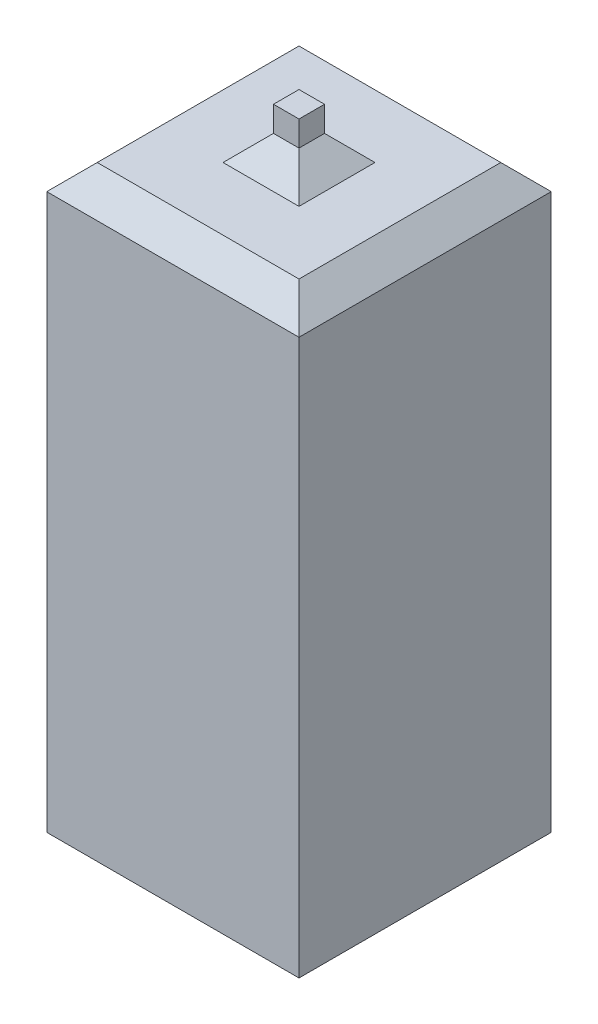
ISO-10303-21;
HEADER;
FILE_DESCRIPTION(('STEP AP214'),'2;1');
FILE_NAME('part.step','',(''),(''),'','','');
FILE_SCHEMA(('AUTOMOTIVE_DESIGN { 1 0 10303 214 1 1 1 1 }'));
ENDSEC;
DATA;
#1=APPLICATION_CONTEXT('core data for automotive mechanical design processes');
#2=APPLICATION_PROTOCOL_DEFINITION('international standard','automotive_design',2000,#1);
#3=PRODUCT_CONTEXT('',#1,'mechanical');
#4=PRODUCT('Part','Part','',(#3));
#5=PRODUCT_RELATED_PRODUCT_CATEGORY('part','',(#4));
#6=PRODUCT_DEFINITION_FORMATION('','',#4);
#7=PRODUCT_DEFINITION_CONTEXT('part definition',#1,'design');
#8=PRODUCT_DEFINITION('design','',#6,#7);
#9=PRODUCT_DEFINITION_SHAPE('','',#8);
#10=(LENGTH_UNIT() NAMED_UNIT(*) SI_UNIT(.MILLI.,.METRE.));
#11=(NAMED_UNIT(*) PLANE_ANGLE_UNIT() SI_UNIT($,.RADIAN.));
#12=(NAMED_UNIT(*) SI_UNIT($,.STERADIAN.) SOLID_ANGLE_UNIT());
#13=UNCERTAINTY_MEASURE_WITH_UNIT(LENGTH_MEASURE(1.E-05),#10,'distance_accuracy_value','');
#14=(GEOMETRIC_REPRESENTATION_CONTEXT(3) GLOBAL_UNCERTAINTY_ASSIGNED_CONTEXT((#13)) GLOBAL_UNIT_ASSIGNED_CONTEXT((#10,
#11,#12)) REPRESENTATION_CONTEXT('',''));
#15=CARTESIAN_POINT('',(0.,0.,0.));
#16=DIRECTION('',(0.,0.,1.));
#17=DIRECTION('',(1.,0.,0.));
#18=AXIS2_PLACEMENT_3D('',#15,#16,#17);
#19=CARTESIAN_POINT('',(0.,1200.,0.));
#20=DIRECTION('',(0.,1.,0.));
#21=DIRECTION('',(0.,0.,1.));
#22=AXIS2_PLACEMENT_3D('',#19,#20,#21);
#23=PLANE('',#22);
#24=DIRECTION('',(-1.,0.,0.));
#25=VECTOR('',#24,1.);
#26=CARTESIAN_POINT('',(0.,1200.,75.2983842453176));
#27=LINE('',#26,#25);
#28=CARTESIAN_POINT('',(75.2983842453176,1200.,75.2983842453176));
#29=VERTEX_POINT('',#28);
#30=CARTESIAN_POINT('',(-75.2983842453176,1200.,75.2983842453176));
#31=VERTEX_POINT('',#30);
#32=EDGE_CURVE('E215',#29,#31,#27,.T.);
#33=ORIENTED_EDGE('',*,*,#32,.T.);
#34=DIRECTION('',(0.,0.,-1.));
#35=VECTOR('',#34,1.);
#36=CARTESIAN_POINT('',(-75.2983842453176,1200.,0.));
#37=LINE('',#36,#35);
#38=CARTESIAN_POINT('',(-75.2983842453176,1200.,-75.2983842453176));
#39=VERTEX_POINT('',#38);
#40=EDGE_CURVE('E217',#31,#39,#37,.T.);
#41=ORIENTED_EDGE('',*,*,#40,.T.);
#42=DIRECTION('',(1.,0.,0.));
#43=VECTOR('',#42,1.);
#44=CARTESIAN_POINT('',(0.,1200.,-75.2983842453176));
#45=LINE('',#44,#43);
#46=CARTESIAN_POINT('',(75.2983842453176,1200.,-75.2983842453176));
#47=VERTEX_POINT('',#46);
#48=EDGE_CURVE('E211',#39,#47,#45,.T.);
#49=ORIENTED_EDGE('',*,*,#48,.T.);
#50=DIRECTION('',(0.,0.,1.));
#51=VECTOR('',#50,1.);
#52=CARTESIAN_POINT('',(75.2983842453176,1200.,0.));
#53=LINE('',#52,#51);
#54=EDGE_CURVE('E213',#47,#29,#53,.T.);
#55=ORIENTED_EDGE('',*,*,#54,.T.);
#56=EDGE_LOOP('',(#33,#41,#49,#55));
#57=FACE_BOUND('',#56,.T.);
#58=DIRECTION('',(0.,0.,1.));
#59=VECTOR('',#58,1.);
#60=CARTESIAN_POINT('',(-200.,1200.,250.));
#61=LINE('',#60,#59);
#62=CARTESIAN_POINT('',(-200.,1200.,-200.));
#63=VERTEX_POINT('',#62);
#64=CARTESIAN_POINT('',(-200.,1200.,200.));
#65=VERTEX_POINT('',#64);
#66=EDGE_CURVE('E206',#63,#65,#61,.T.);
#67=ORIENTED_EDGE('',*,*,#66,.T.);
#68=DIRECTION('',(1.,0.,0.));
#69=VECTOR('',#68,1.);
#70=CARTESIAN_POINT('',(250.,1200.,200.));
#71=LINE('',#70,#69);
#72=CARTESIAN_POINT('',(200.,1200.,200.));
#73=VERTEX_POINT('',#72);
#74=EDGE_CURVE('E208',#65,#73,#71,.T.);
#75=ORIENTED_EDGE('',*,*,#74,.T.);
#76=DIRECTION('',(0.,0.,-1.));
#77=VECTOR('',#76,1.);
#78=CARTESIAN_POINT('',(200.,1200.,-250.));
#79=LINE('',#78,#77);
#80=CARTESIAN_POINT('',(200.,1200.,-200.));
#81=VERTEX_POINT('',#80);
#82=EDGE_CURVE('E202',#73,#81,#79,.T.);
#83=ORIENTED_EDGE('',*,*,#82,.T.);
#84=DIRECTION('',(-1.,0.,0.));
#85=VECTOR('',#84,1.);
#86=CARTESIAN_POINT('',(-250.,1200.,-200.));
#87=LINE('',#86,#85);
#88=EDGE_CURVE('E204',#81,#63,#87,.T.);
#89=ORIENTED_EDGE('',*,*,#88,.T.);
#90=EDGE_LOOP('',(#67,#75,#83,#89));
#91=FACE_BOUND('',#90,.T.);
#92=ADVANCED_FACE('F33',(#57,#91),#23,.T.);
#93=CARTESIAN_POINT('',(250.,1200.,-250.));
#94=DIRECTION('',(-1.,0.,0.));
#95=DIRECTION('',(0.,0.,1.));
#96=AXIS2_PLACEMENT_3D('',#93,#94,#95);
#97=PLANE('',#96);
#98=DIRECTION('',(0.,-1.,0.));
#99=VECTOR('',#98,1.);
#100=CARTESIAN_POINT('',(250.,1200.,250.));
#101=LINE('',#100,#99);
#102=CARTESIAN_POINT('',(250.,1150.,250.));
#103=VERTEX_POINT('',#102);
#104=CARTESIAN_POINT('',(250.,50.0000000000003,250.));
#105=VERTEX_POINT('',#104);
#106=EDGE_CURVE('E155',#103,#105,#101,.T.);
#107=ORIENTED_EDGE('',*,*,#106,.T.);
#108=DIRECTION('',(0.,0.,-1.));
#109=VECTOR('',#108,1.);
#110=CARTESIAN_POINT('',(250.,50.0000000000003,-250.));
#111=LINE('',#110,#109);
#112=CARTESIAN_POINT('',(250.,50.0000000000003,-250.));
#113=VERTEX_POINT('',#112);
#114=EDGE_CURVE('E197',#105,#113,#111,.T.);
#115=ORIENTED_EDGE('',*,*,#114,.T.);
#116=DIRECTION('',(0.,-1.,0.));
#117=VECTOR('',#116,1.);
#118=CARTESIAN_POINT('',(250.,1200.,-250.));
#119=LINE('',#118,#117);
#120=CARTESIAN_POINT('',(250.,1150.,-250.));
#121=VERTEX_POINT('',#120);
#122=EDGE_CURVE('E169',#121,#113,#119,.T.);
#123=ORIENTED_EDGE('',*,*,#122,.F.);
#124=DIRECTION('',(0.,0.,1.));
#125=VECTOR('',#124,1.);
#126=CARTESIAN_POINT('',(250.,1150.,250.));
#127=LINE('',#126,#125);
#128=EDGE_CURVE('E195',#121,#103,#127,.T.);
#129=ORIENTED_EDGE('',*,*,#128,.T.);
#130=EDGE_LOOP('',(#107,#115,#123,#129));
#131=FACE_BOUND('',#130,.T.);
#132=ADVANCED_FACE('F266',(#131),#97,.F.);
#133=CARTESIAN_POINT('',(-250.,1200.,-250.));
#134=DIRECTION('',(0.,0.,1.));
#135=DIRECTION('',(1.,0.,0.));
#136=AXIS2_PLACEMENT_3D('',#133,#134,#135);
#137=PLANE('',#136);
#138=ORIENTED_EDGE('',*,*,#122,.T.);
#139=DIRECTION('',(-1.,0.,0.));
#140=VECTOR('',#139,1.);
#141=CARTESIAN_POINT('',(-250.,50.0000000000003,-250.));
#142=LINE('',#141,#140);
#143=CARTESIAN_POINT('',(-250.,50.0000000000003,-250.));
#144=VERTEX_POINT('',#143);
#145=EDGE_CURVE('E174',#113,#144,#142,.T.);
#146=ORIENTED_EDGE('',*,*,#145,.T.);
#147=DIRECTION('',(0.,-1.,0.));
#148=VECTOR('',#147,1.);
#149=CARTESIAN_POINT('',(-250.,1200.,-250.));
#150=LINE('',#149,#148);
#151=CARTESIAN_POINT('',(-250.,1150.,-250.));
#152=VERTEX_POINT('',#151);
#153=EDGE_CURVE('E166',#152,#144,#150,.T.);
#154=ORIENTED_EDGE('',*,*,#153,.F.);
#155=DIRECTION('',(1.,0.,0.));
#156=VECTOR('',#155,1.);
#157=CARTESIAN_POINT('',(250.,1150.,-250.));
#158=LINE('',#157,#156);
#159=EDGE_CURVE('E172',#152,#121,#158,.T.);
#160=ORIENTED_EDGE('',*,*,#159,.T.);
#161=EDGE_LOOP('',(#138,#146,#154,#160));
#162=FACE_BOUND('',#161,.T.);
#163=ADVANCED_FACE('F263',(#162),#137,.F.);
#164=CARTESIAN_POINT('',(-250.,1200.,-250.));
#165=DIRECTION('',(1.,0.,0.));
#166=DIRECTION('',(0.,0.,-1.));
#167=AXIS2_PLACEMENT_3D('',#164,#165,#166);
#168=PLANE('',#167);
#169=ORIENTED_EDGE('',*,*,#153,.T.);
#170=DIRECTION('',(0.,0.,1.));
#171=VECTOR('',#170,1.);
#172=CARTESIAN_POINT('',(-250.,50.0000000000003,-250.));
#173=LINE('',#172,#171);
#174=CARTESIAN_POINT('',(-250.,50.0000000000003,250.));
#175=VERTEX_POINT('',#174);
#176=EDGE_CURVE('E188',#144,#175,#173,.T.);
#177=ORIENTED_EDGE('',*,*,#176,.T.);
#178=DIRECTION('',(0.,-1.,0.));
#179=VECTOR('',#178,1.);
#180=CARTESIAN_POINT('',(-250.,1200.,250.));
#181=LINE('',#180,#179);
#182=CARTESIAN_POINT('',(-250.,1150.,250.));
#183=VERTEX_POINT('',#182);
#184=EDGE_CURVE('E158',#183,#175,#181,.T.);
#185=ORIENTED_EDGE('',*,*,#184,.F.);
#186=DIRECTION('',(0.,0.,-1.));
#187=VECTOR('',#186,1.);
#188=CARTESIAN_POINT('',(-250.,1150.,-250.));
#189=LINE('',#188,#187);
#190=EDGE_CURVE('E186',#183,#152,#189,.T.);
#191=ORIENTED_EDGE('',*,*,#190,.T.);
#192=EDGE_LOOP('',(#169,#177,#185,#191));
#193=FACE_BOUND('',#192,.T.);
#194=ADVANCED_FACE('F280',(#193),#168,.F.);
#195=CARTESIAN_POINT('',(-250.,1200.,250.));
#196=DIRECTION('',(0.,0.,-1.));
#197=DIRECTION('',(-1.,0.,0.));
#198=AXIS2_PLACEMENT_3D('',#195,#196,#197);
#199=PLANE('',#198);
#200=ORIENTED_EDGE('',*,*,#184,.T.);
#201=DIRECTION('',(1.,0.,0.));
#202=VECTOR('',#201,1.);
#203=CARTESIAN_POINT('',(-250.,50.0000000000003,250.));
#204=LINE('',#203,#202);
#205=EDGE_CURVE('E193',#175,#105,#204,.T.);
#206=ORIENTED_EDGE('',*,*,#205,.T.);
#207=ORIENTED_EDGE('',*,*,#106,.F.);
#208=DIRECTION('',(-1.,0.,0.));
#209=VECTOR('',#208,1.);
#210=CARTESIAN_POINT('',(-250.,1150.,250.));
#211=LINE('',#210,#209);
#212=EDGE_CURVE('E190',#103,#183,#211,.T.);
#213=ORIENTED_EDGE('',*,*,#212,.T.);
#214=EDGE_LOOP('',(#200,#206,#207,#213));
#215=FACE_BOUND('',#214,.T.);
#216=ADVANCED_FACE('F284',(#215),#199,.F.);
#217=CARTESIAN_POINT('',(0.,0.,0.));
#218=DIRECTION('',(0.,1.,0.));
#219=DIRECTION('',(0.,0.,1.));
#220=AXIS2_PLACEMENT_3D('',#217,#218,#219);
#221=PLANE('',#220);
#222=DIRECTION('',(0.,0.,-1.));
#223=VECTOR('',#222,1.);
#224=CARTESIAN_POINT('',(-200.,0.,0.));
#225=LINE('',#224,#223);
#226=CARTESIAN_POINT('',(-200.,0.,200.));
#227=VERTEX_POINT('',#226);
#228=CARTESIAN_POINT('',(-200.,0.,-200.));
#229=VERTEX_POINT('',#228);
#230=EDGE_CURVE('E181',#227,#229,#225,.T.);
#231=ORIENTED_EDGE('',*,*,#230,.T.);
#232=DIRECTION('',(1.,0.,0.));
#233=VECTOR('',#232,1.);
#234=CARTESIAN_POINT('',(0.,0.,-200.));
#235=LINE('',#234,#233);
#236=CARTESIAN_POINT('',(200.,0.,-200.));
#237=VERTEX_POINT('',#236);
#238=EDGE_CURVE('E183',#229,#237,#235,.T.);
#239=ORIENTED_EDGE('',*,*,#238,.T.);
#240=DIRECTION('',(0.,0.,1.));
#241=VECTOR('',#240,1.);
#242=CARTESIAN_POINT('',(200.,0.,0.));
#243=LINE('',#242,#241);
#244=CARTESIAN_POINT('',(200.,0.,200.));
#245=VERTEX_POINT('',#244);
#246=EDGE_CURVE('E177',#237,#245,#243,.T.);
#247=ORIENTED_EDGE('',*,*,#246,.T.);
#248=DIRECTION('',(-1.,0.,0.));
#249=VECTOR('',#248,1.);
#250=CARTESIAN_POINT('',(0.,0.,200.));
#251=LINE('',#250,#249);
#252=EDGE_CURVE('E179',#245,#227,#251,.T.);
#253=ORIENTED_EDGE('',*,*,#252,.T.);
#254=EDGE_LOOP('',(#231,#239,#247,#253));
#255=FACE_BOUND('',#254,.T.);
#256=ADVANCED_FACE('F294',(#255),#221,.F.);
#257=CARTESIAN_POINT('',(25.2983842453178,1300.,-25.2983842453178));
#258=DIRECTION('',(-1.,0.,0.));
#259=DIRECTION('',(0.,0.,1.));
#260=AXIS2_PLACEMENT_3D('',#257,#258,#259);
#261=PLANE('',#260);
#262=DIRECTION('',(0.,-1.,0.));
#263=VECTOR('',#262,1.);
#264=CARTESIAN_POINT('',(25.2983842453178,1300.,25.2983842453178));
#265=LINE('',#264,#263);
#266=CARTESIAN_POINT('',(25.2983842453178,1300.,25.2983842453178));
#267=VERTEX_POINT('',#266);
#268=CARTESIAN_POINT('',(25.2983842453178,1250.,25.2983842453178));
#269=VERTEX_POINT('',#268);
#270=EDGE_CURVE('E506',#267,#269,#265,.T.);
#271=ORIENTED_EDGE('',*,*,#270,.T.);
#272=DIRECTION('',(0.,0.,-1.));
#273=VECTOR('',#272,1.);
#274=CARTESIAN_POINT('',(25.2983842453178,1250.,-25.2983842453178));
#275=LINE('',#274,#273);
#276=CARTESIAN_POINT('',(25.2983842453178,1250.,-25.2983842453178));
#277=VERTEX_POINT('',#276);
#278=EDGE_CURVE('E42',#269,#277,#275,.T.);
#279=ORIENTED_EDGE('',*,*,#278,.T.);
#280=DIRECTION('',(0.,-1.,0.));
#281=VECTOR('',#280,1.);
#282=CARTESIAN_POINT('',(25.2983842453178,1300.,-25.2983842453178));
#283=LINE('',#282,#281);
#284=CARTESIAN_POINT('',(25.2983842453178,1300.,-25.2983842453178));
#285=VERTEX_POINT('',#284);
#286=EDGE_CURVE('E139',#285,#277,#283,.T.);
#287=ORIENTED_EDGE('',*,*,#286,.F.);
#288=DIRECTION('',(0.,0.,-1.));
#289=VECTOR('',#288,1.);
#290=CARTESIAN_POINT('',(25.2983842453178,1300.,-25.2983842453178));
#291=LINE('',#290,#289);
#292=EDGE_CURVE('E146',#267,#285,#291,.T.);
#293=ORIENTED_EDGE('',*,*,#292,.F.);
#294=EDGE_LOOP('',(#271,#279,#287,#293));
#295=FACE_BOUND('',#294,.T.);
#296=ADVANCED_FACE('F154',(#295),#261,.F.);
#297=CARTESIAN_POINT('',(-25.2983842453178,1300.,-25.2983842453178));
#298=DIRECTION('',(0.,0.,1.));
#299=DIRECTION('',(1.,0.,0.));
#300=AXIS2_PLACEMENT_3D('',#297,#298,#299);
#301=PLANE('',#300);
#302=ORIENTED_EDGE('',*,*,#286,.T.);
#303=DIRECTION('',(-1.,0.,0.));
#304=VECTOR('',#303,1.);
#305=CARTESIAN_POINT('',(-25.2983842453178,1250.,-25.2983842453178));
#306=LINE('',#305,#304);
#307=CARTESIAN_POINT('',(-25.2983842453178,1250.,-25.2983842453178));
#308=VERTEX_POINT('',#307);
#309=EDGE_CURVE('E11',#277,#308,#306,.T.);
#310=ORIENTED_EDGE('',*,*,#309,.T.);
#311=DIRECTION('',(0.,-1.,0.));
#312=VECTOR('',#311,1.);
#313=CARTESIAN_POINT('',(-25.2983842453178,1300.,-25.2983842453178));
#314=LINE('',#313,#312);
#315=CARTESIAN_POINT('',(-25.2983842453178,1300.,-25.2983842453178));
#316=VERTEX_POINT('',#315);
#317=EDGE_CURVE('E142',#316,#308,#314,.T.);
#318=ORIENTED_EDGE('',*,*,#317,.F.);
#319=DIRECTION('',(-1.,0.,0.));
#320=VECTOR('',#319,1.);
#321=CARTESIAN_POINT('',(-25.2983842453178,1300.,-25.2983842453178));
#322=LINE('',#321,#320);
#323=EDGE_CURVE('E136',#285,#316,#322,.T.);
#324=ORIENTED_EDGE('',*,*,#323,.F.);
#325=EDGE_LOOP('',(#302,#310,#318,#324));
#326=FACE_BOUND('',#325,.T.);
#327=ADVANCED_FACE('F138',(#326),#301,.F.);
#328=CARTESIAN_POINT('',(-25.2983842453178,1300.,-25.2983842453178));
#329=DIRECTION('',(1.,0.,0.));
#330=DIRECTION('',(0.,0.,-1.));
#331=AXIS2_PLACEMENT_3D('',#328,#329,#330);
#332=PLANE('',#331);
#333=ORIENTED_EDGE('',*,*,#317,.T.);
#334=DIRECTION('',(0.,0.,1.));
#335=VECTOR('',#334,1.);
#336=CARTESIAN_POINT('',(-25.2983842453178,1250.,-25.2983842453178));
#337=LINE('',#336,#335);
#338=CARTESIAN_POINT('',(-25.2983842453178,1250.,25.2983842453178));
#339=VERTEX_POINT('',#338);
#340=EDGE_CURVE('E199',#308,#339,#337,.T.);
#341=ORIENTED_EDGE('',*,*,#340,.T.);
#342=DIRECTION('',(0.,-1.,0.));
#343=VECTOR('',#342,1.);
#344=CARTESIAN_POINT('',(-25.2983842453178,1300.,25.2983842453178));
#345=LINE('',#344,#343);
#346=CARTESIAN_POINT('',(-25.2983842453178,1300.,25.2983842453178));
#347=VERTEX_POINT('',#346);
#348=EDGE_CURVE('E160',#347,#339,#345,.T.);
#349=ORIENTED_EDGE('',*,*,#348,.F.);
#350=DIRECTION('',(0.,0.,1.));
#351=VECTOR('',#350,1.);
#352=CARTESIAN_POINT('',(-25.2983842453178,1300.,-25.2983842453178));
#353=LINE('',#352,#351);
#354=EDGE_CURVE('E145',#316,#347,#353,.T.);
#355=ORIENTED_EDGE('',*,*,#354,.F.);
#356=EDGE_LOOP('',(#333,#341,#349,#355));
#357=FACE_BOUND('',#356,.T.);
#358=ADVANCED_FACE('F314',(#357),#332,.F.);
#359=CARTESIAN_POINT('',(-25.2983842453178,1300.,25.2983842453178));
#360=DIRECTION('',(0.,0.,-1.));
#361=DIRECTION('',(-1.,0.,0.));
#362=AXIS2_PLACEMENT_3D('',#359,#360,#361);
#363=PLANE('',#362);
#364=ORIENTED_EDGE('',*,*,#348,.T.);
#365=DIRECTION('',(1.,0.,0.));
#366=VECTOR('',#365,1.);
#367=CARTESIAN_POINT('',(-25.2983842453178,1250.,25.2983842453178));
#368=LINE('',#367,#366);
#369=EDGE_CURVE('E57',#339,#269,#368,.T.);
#370=ORIENTED_EDGE('',*,*,#369,.T.);
#371=ORIENTED_EDGE('',*,*,#270,.F.);
#372=DIRECTION('',(1.,0.,0.));
#373=VECTOR('',#372,1.);
#374=CARTESIAN_POINT('',(-25.2983842453178,1300.,25.2983842453178));
#375=LINE('',#374,#373);
#376=EDGE_CURVE('E151',#347,#267,#375,.T.);
#377=ORIENTED_EDGE('',*,*,#376,.F.);
#378=EDGE_LOOP('',(#364,#370,#371,#377));
#379=FACE_BOUND('',#378,.T.);
#380=ADVANCED_FACE('F317',(#379),#363,.F.);
#381=CARTESIAN_POINT('',(0.,1300.,0.));
#382=DIRECTION('',(0.,1.,0.));
#383=DIRECTION('',(0.,0.,1.));
#384=AXIS2_PLACEMENT_3D('',#381,#382,#383);
#385=PLANE('',#384);
#386=ORIENTED_EDGE('',*,*,#292,.T.);
#387=ORIENTED_EDGE('',*,*,#323,.T.);
#388=ORIENTED_EDGE('',*,*,#354,.T.);
#389=ORIENTED_EDGE('',*,*,#376,.T.);
#390=EDGE_LOOP('',(#386,#387,#388,#389));
#391=FACE_BOUND('',#390,.T.);
#392=ADVANCED_FACE('F149',(#391),#385,.T.);
#393=CARTESIAN_POINT('',(-250.,50.0000000000003,250.));
#394=DIRECTION('',(0.,0.707106781186548,-0.707106781186548));
#395=DIRECTION('',(1.,0.,0.));
#396=AXIS2_PLACEMENT_3D('',#393,#394,#395);
#397=PLANE('',#396);
#398=DIRECTION('',(0.577350269189626,-0.577350269189626,-0.577350269189626));
#399=VECTOR('',#398,1.);
#400=CARTESIAN_POINT('',(-250.,50.0000000000003,250.));
#401=LINE('',#400,#399);
#402=EDGE_CURVE('E227',#227,#175,#401,.F.);
#403=ORIENTED_EDGE('',*,*,#402,.F.);
#404=ORIENTED_EDGE('',*,*,#252,.F.);
#405=DIRECTION('',(-0.577350269189626,-0.577350269189626,-0.577350269189626));
#406=VECTOR('',#405,1.);
#407=CARTESIAN_POINT('',(83.3333333333334,-116.666666666666,83.3333333333333));
#408=LINE('',#407,#406);
#409=EDGE_CURVE('E152',#105,#245,#408,.T.);
#410=ORIENTED_EDGE('',*,*,#409,.F.);
#411=ORIENTED_EDGE('',*,*,#205,.F.);
#412=EDGE_LOOP('',(#403,#404,#410,#411));
#413=FACE_BOUND('',#412,.T.);
#414=ADVANCED_FACE('F288',(#413),#397,.F.);
#415=CARTESIAN_POINT('',(250.,50.0000000000003,-250.));
#416=DIRECTION('',(-0.707106781186548,0.707106781186548,0.));
#417=DIRECTION('',(0.,0.,-1.));
#418=AXIS2_PLACEMENT_3D('',#415,#416,#417);
#419=PLANE('',#418);
#420=ORIENTED_EDGE('',*,*,#409,.T.);
#421=ORIENTED_EDGE('',*,*,#246,.F.);
#422=DIRECTION('',(0.577350269189626,0.577350269189626,-0.577350269189626));
#423=VECTOR('',#422,1.);
#424=CARTESIAN_POINT('',(250.,50.0000000000003,-250.));
#425=LINE('',#424,#423);
#426=EDGE_CURVE('E224',#113,#237,#425,.F.);
#427=ORIENTED_EDGE('',*,*,#426,.F.);
#428=ORIENTED_EDGE('',*,*,#114,.F.);
#429=EDGE_LOOP('',(#420,#421,#427,#428));
#430=FACE_BOUND('',#429,.T.);
#431=ADVANCED_FACE('F271',(#430),#419,.F.);
#432=CARTESIAN_POINT('',(-250.,50.0000000000003,-250.));
#433=DIRECTION('',(0.707106781186548,0.707106781186548,0.));
#434=DIRECTION('',(0.,0.,1.));
#435=AXIS2_PLACEMENT_3D('',#432,#433,#434);
#436=PLANE('',#435);
#437=ORIENTED_EDGE('',*,*,#402,.T.);
#438=ORIENTED_EDGE('',*,*,#176,.F.);
#439=DIRECTION('',(0.577350269189626,-0.577350269189626,0.577350269189626));
#440=VECTOR('',#439,1.);
#441=CARTESIAN_POINT('',(-250.,50.0000000000003,-250.));
#442=LINE('',#441,#440);
#443=EDGE_CURVE('E222',#229,#144,#442,.F.);
#444=ORIENTED_EDGE('',*,*,#443,.F.);
#445=ORIENTED_EDGE('',*,*,#230,.F.);
#446=EDGE_LOOP('',(#437,#438,#444,#445));
#447=FACE_BOUND('',#446,.T.);
#448=ADVANCED_FACE('F292',(#447),#436,.F.);
#449=CARTESIAN_POINT('',(-250.,50.0000000000003,-250.));
#450=DIRECTION('',(0.,0.707106781186548,0.707106781186548));
#451=DIRECTION('',(-1.,0.,0.));
#452=AXIS2_PLACEMENT_3D('',#449,#450,#451);
#453=PLANE('',#452);
#454=ORIENTED_EDGE('',*,*,#426,.T.);
#455=ORIENTED_EDGE('',*,*,#238,.F.);
#456=ORIENTED_EDGE('',*,*,#443,.T.);
#457=ORIENTED_EDGE('',*,*,#145,.F.);
#458=EDGE_LOOP('',(#454,#455,#456,#457));
#459=FACE_BOUND('',#458,.T.);
#460=ADVANCED_FACE('F276',(#459),#453,.F.);
#461=CARTESIAN_POINT('',(25.2983842453178,1250.,-25.2983842453178));
#462=DIRECTION('',(-0.707106781186552,-0.707106781186543,0.));
#463=DIRECTION('',(0.,0.,-1.));
#464=AXIS2_PLACEMENT_3D('',#461,#462,#463);
#465=PLANE('',#464);
#466=DIRECTION('',(0.577350269189623,-0.577350269189631,0.577350269189623));
#467=VECTOR('',#466,1.);
#468=CARTESIAN_POINT('',(8.43279474843943,1266.86558949688,8.43279474843941));
#469=LINE('',#468,#467);
#470=EDGE_CURVE('E236',#29,#269,#469,.F.);
#471=ORIENTED_EDGE('',*,*,#470,.F.);
#472=ORIENTED_EDGE('',*,*,#54,.F.);
#473=DIRECTION('',(0.577350269189623,-0.577350269189631,-0.577350269189623));
#474=VECTOR('',#473,1.);
#475=CARTESIAN_POINT('',(8.43279474843941,1266.86558949688,-8.43279474843943));
#476=LINE('',#475,#474);
#477=EDGE_CURVE('E225',#277,#47,#476,.T.);
#478=ORIENTED_EDGE('',*,*,#477,.F.);
#479=ORIENTED_EDGE('',*,*,#278,.F.);
#480=EDGE_LOOP('',(#471,#472,#478,#479));
#481=FACE_BOUND('',#480,.T.);
#482=ADVANCED_FACE('F343',(#481),#465,.F.);
#483=CARTESIAN_POINT('',(-25.2983842453178,1250.,-25.2983842453178));
#484=DIRECTION('',(0.,-0.707106781186543,0.707106781186552));
#485=DIRECTION('',(-1.,0.,0.));
#486=AXIS2_PLACEMENT_3D('',#483,#484,#485);
#487=PLANE('',#486);
#488=ORIENTED_EDGE('',*,*,#477,.T.);
#489=ORIENTED_EDGE('',*,*,#48,.F.);
#490=DIRECTION('',(0.577350269189623,0.577350269189631,0.577350269189623));
#491=VECTOR('',#490,1.);
#492=CARTESIAN_POINT('',(-25.2983842453178,1250.,-25.2983842453178));
#493=LINE('',#492,#491);
#494=EDGE_CURVE('E234',#308,#39,#493,.F.);
#495=ORIENTED_EDGE('',*,*,#494,.F.);
#496=ORIENTED_EDGE('',*,*,#309,.F.);
#497=EDGE_LOOP('',(#488,#489,#495,#496));
#498=FACE_BOUND('',#497,.T.);
#499=ADVANCED_FACE('F339',(#498),#487,.F.);
#500=CARTESIAN_POINT('',(-25.2983842453178,1250.,25.2983842453178));
#501=DIRECTION('',(0.,-0.707106781186543,-0.707106781186552));
#502=DIRECTION('',(1.,0.,0.));
#503=AXIS2_PLACEMENT_3D('',#500,#501,#502);
#504=PLANE('',#503);
#505=ORIENTED_EDGE('',*,*,#470,.T.);
#506=ORIENTED_EDGE('',*,*,#369,.F.);
#507=DIRECTION('',(-0.577350269189623,-0.577350269189631,0.577350269189623));
#508=VECTOR('',#507,1.);
#509=CARTESIAN_POINT('',(-25.2983842453178,1250.,25.2983842453178));
#510=LINE('',#509,#508);
#511=EDGE_CURVE('E232',#31,#339,#510,.F.);
#512=ORIENTED_EDGE('',*,*,#511,.F.);
#513=ORIENTED_EDGE('',*,*,#32,.F.);
#514=EDGE_LOOP('',(#505,#506,#512,#513));
#515=FACE_BOUND('',#514,.T.);
#516=ADVANCED_FACE('F335',(#515),#504,.F.);
#517=CARTESIAN_POINT('',(-25.2983842453178,1250.,-25.2983842453178));
#518=DIRECTION('',(0.707106781186552,-0.707106781186543,0.));
#519=DIRECTION('',(0.,0.,1.));
#520=AXIS2_PLACEMENT_3D('',#517,#518,#519);
#521=PLANE('',#520);
#522=ORIENTED_EDGE('',*,*,#494,.T.);
#523=ORIENTED_EDGE('',*,*,#40,.F.);
#524=ORIENTED_EDGE('',*,*,#511,.T.);
#525=ORIENTED_EDGE('',*,*,#340,.F.);
#526=EDGE_LOOP('',(#522,#523,#524,#525));
#527=FACE_BOUND('',#526,.T.);
#528=ADVANCED_FACE('F332',(#527),#521,.F.);
#529=CARTESIAN_POINT('',(0.,1200.,-200.));
#530=DIRECTION('',(0.,0.707106781186546,-0.707106781186549));
#531=DIRECTION('',(1.,0.,0.));
#532=AXIS2_PLACEMENT_3D('',#529,#530,#531);
#533=PLANE('',#532);
#534=DIRECTION('',(-0.577350269189625,0.577350269189628,0.577350269189625));
#535=VECTOR('',#534,1.);
#536=CARTESIAN_POINT('',(133.333333333334,1266.66666666667,-133.333333333334));
#537=LINE('',#536,#535);
#538=EDGE_CURVE('E244',#121,#81,#537,.T.);
#539=ORIENTED_EDGE('',*,*,#538,.F.);
#540=ORIENTED_EDGE('',*,*,#159,.F.);
#541=DIRECTION('',(0.577350269189625,0.577350269189627,0.577350269189625));
#542=VECTOR('',#541,1.);
#543=CARTESIAN_POINT('',(-133.333333333334,1266.66666666667,-133.333333333334));
#544=LINE('',#543,#542);
#545=EDGE_CURVE('E37',#63,#152,#544,.F.);
#546=ORIENTED_EDGE('',*,*,#545,.F.);
#547=ORIENTED_EDGE('',*,*,#88,.F.);
#548=EDGE_LOOP('',(#539,#540,#546,#547));
#549=FACE_BOUND('',#548,.T.);
#550=ADVANCED_FACE('F35',(#549),#533,.T.);
#551=CARTESIAN_POINT('',(-200.,1200.,0.));
#552=DIRECTION('',(-0.707106781186549,0.707106781186546,0.));
#553=DIRECTION('',(0.,0.,-1.));
#554=AXIS2_PLACEMENT_3D('',#551,#552,#553);
#555=PLANE('',#554);
#556=ORIENTED_EDGE('',*,*,#545,.T.);
#557=ORIENTED_EDGE('',*,*,#190,.F.);
#558=DIRECTION('',(0.577350269189625,0.577350269189627,-0.577350269189625));
#559=VECTOR('',#558,1.);
#560=CARTESIAN_POINT('',(-133.333333333334,1266.66666666667,133.333333333334));
#561=LINE('',#560,#559);
#562=EDGE_CURVE('E243',#65,#183,#561,.F.);
#563=ORIENTED_EDGE('',*,*,#562,.F.);
#564=ORIENTED_EDGE('',*,*,#66,.F.);
#565=EDGE_LOOP('',(#556,#557,#563,#564));
#566=FACE_BOUND('',#565,.T.);
#567=ADVANCED_FACE('F255',(#566),#555,.T.);
#568=CARTESIAN_POINT('',(200.,1200.,0.));
#569=DIRECTION('',(0.707106781186549,0.707106781186546,0.));
#570=DIRECTION('',(0.,0.,1.));
#571=AXIS2_PLACEMENT_3D('',#568,#569,#570);
#572=PLANE('',#571);
#573=ORIENTED_EDGE('',*,*,#538,.T.);
#574=ORIENTED_EDGE('',*,*,#82,.F.);
#575=DIRECTION('',(0.577350269189625,-0.577350269189627,0.577350269189625));
#576=VECTOR('',#575,1.);
#577=CARTESIAN_POINT('',(133.333333333334,1266.66666666667,133.333333333334));
#578=LINE('',#577,#576);
#579=EDGE_CURVE('E241',#103,#73,#578,.F.);
#580=ORIENTED_EDGE('',*,*,#579,.F.);
#581=ORIENTED_EDGE('',*,*,#128,.F.);
#582=EDGE_LOOP('',(#573,#574,#580,#581));
#583=FACE_BOUND('',#582,.T.);
#584=ADVANCED_FACE('F351',(#583),#572,.T.);
#585=CARTESIAN_POINT('',(0.,1200.,200.));
#586=DIRECTION('',(0.,0.707106781186546,0.707106781186549));
#587=DIRECTION('',(-1.,0.,0.));
#588=AXIS2_PLACEMENT_3D('',#585,#586,#587);
#589=PLANE('',#588);
#590=ORIENTED_EDGE('',*,*,#562,.T.);
#591=ORIENTED_EDGE('',*,*,#212,.F.);
#592=ORIENTED_EDGE('',*,*,#579,.T.);
#593=ORIENTED_EDGE('',*,*,#74,.F.);
#594=EDGE_LOOP('',(#590,#591,#592,#593));
#595=FACE_BOUND('',#594,.T.);
#596=ADVANCED_FACE('F348',(#595),#589,.T.);
#597=CLOSED_SHELL('',(#92,#132,#163,#194,#216,#256,#296,#327,#358,#380,#392,#414,#431,#448,#460,
#482,#499,#516,#528,#550,#567,#584,#596));
#598=MANIFOLD_SOLID_BREP('B2',#597);
#599=ADVANCED_BREP_SHAPE_REPRESENTATION('',(#18,#598),#14);
#600=SHAPE_DEFINITION_REPRESENTATION(#9,#599);
ENDSEC;
END-ISO-10303-21;
